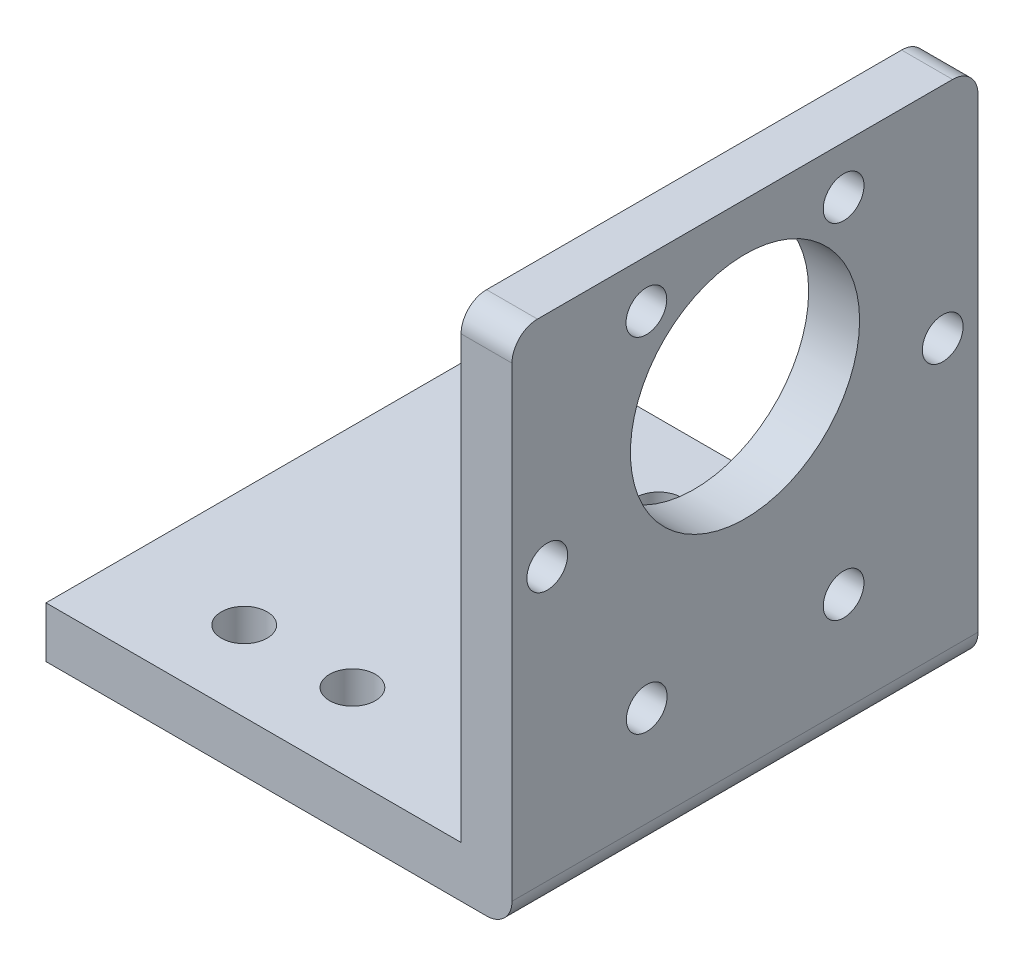
ISO-10303-21;
HEADER;
FILE_DESCRIPTION(('STEP AP214'),'2;1');
FILE_NAME('part.step','',(''),(''),'','','');
FILE_SCHEMA(('AUTOMOTIVE_DESIGN { 1 0 10303 214 1 1 1 1 }'));
ENDSEC;
DATA;
#1=APPLICATION_CONTEXT('core data for automotive mechanical design processes');
#2=APPLICATION_PROTOCOL_DEFINITION('international standard','automotive_design',2000,#1);
#3=PRODUCT_CONTEXT('',#1,'mechanical');
#4=PRODUCT('Part','Part','',(#3));
#5=PRODUCT_RELATED_PRODUCT_CATEGORY('part','',(#4));
#6=PRODUCT_DEFINITION_FORMATION('','',#4);
#7=PRODUCT_DEFINITION_CONTEXT('part definition',#1,'design');
#8=PRODUCT_DEFINITION('design','',#6,#7);
#9=PRODUCT_DEFINITION_SHAPE('','',#8);
#10=(LENGTH_UNIT() NAMED_UNIT(*) SI_UNIT(.MILLI.,.METRE.));
#11=(NAMED_UNIT(*) PLANE_ANGLE_UNIT() SI_UNIT($,.RADIAN.));
#12=(NAMED_UNIT(*) SI_UNIT($,.STERADIAN.) SOLID_ANGLE_UNIT());
#13=UNCERTAINTY_MEASURE_WITH_UNIT(LENGTH_MEASURE(1.E-05),#10,'distance_accuracy_value','');
#14=(GEOMETRIC_REPRESENTATION_CONTEXT(3) GLOBAL_UNCERTAINTY_ASSIGNED_CONTEXT((#13)) GLOBAL_UNIT_ASSIGNED_CONTEXT((#10,
#11,#12)) REPRESENTATION_CONTEXT('',''));
#15=CARTESIAN_POINT('',(0.,0.,0.));
#16=DIRECTION('',(0.,0.,1.));
#17=DIRECTION('',(1.,0.,0.));
#18=AXIS2_PLACEMENT_3D('',#15,#16,#17);
#19=CARTESIAN_POINT('',(18.3,40.6,18.3));
#20=DIRECTION('',(-1.,0.,0.));
#21=DIRECTION('',(0.,0.,1.));
#22=AXIS2_PLACEMENT_3D('',#19,#20,#21);
#23=PLANE('',#22);
#24=CARTESIAN_POINT('',(18.3,9.85104244990387,7.71897426241833));
#25=DIRECTION('',(1.,0.,0.));
#26=DIRECTION('',(0.,0.,-1.));
#27=AXIS2_PLACEMENT_3D('',#24,#25,#26);
#28=CIRCLE('',#27,1.6);
#29=CARTESIAN_POINT('',(18.3,9.85104244990387,6.11897426241833));
#30=VERTEX_POINT('',#29);
#31=EDGE_CURVE('E213',#30,#30,#28,.T.);
#32=ORIENTED_EDGE('',*,*,#31,.F.);
#33=EDGE_LOOP('',(#32));
#34=FACE_BOUND('',#33,.T.);
#35=CARTESIAN_POINT('',(18.3,9.85104244990387,-7.74523523434163));
#36=DIRECTION('',(1.,0.,0.));
#37=DIRECTION('',(0.,0.,-1.));
#38=AXIS2_PLACEMENT_3D('',#35,#36,#37);
#39=CIRCLE('',#38,1.6);
#40=CARTESIAN_POINT('',(18.3,9.85104244990387,-9.34523523434163));
#41=VERTEX_POINT('',#40);
#42=EDGE_CURVE('E217',#41,#41,#39,.T.);
#43=ORIENTED_EDGE('',*,*,#42,.F.);
#44=EDGE_LOOP('',(#43));
#45=FACE_BOUND('',#44,.T.);
#46=CARTESIAN_POINT('',(18.3,23.3800970600801,-15.5299775834848));
#47=DIRECTION('',(1.,0.,0.));
#48=DIRECTION('',(0.,0.,-1.));
#49=AXIS2_PLACEMENT_3D('',#46,#47,#48);
#50=CIRCLE('',#49,1.6);
#51=CARTESIAN_POINT('',(18.3,23.3800970600801,-17.1299775834848));
#52=VERTEX_POINT('',#51);
#53=EDGE_CURVE('E222',#52,#52,#50,.T.);
#54=ORIENTED_EDGE('',*,*,#53,.F.);
#55=EDGE_LOOP('',(#54));
#56=FACE_BOUND('',#55,.T.);
#57=CARTESIAN_POINT('',(18.3,23.3800970600801,15.5299775834848));
#58=DIRECTION('',(1.,0.,0.));
#59=DIRECTION('',(0.,0.,-1.));
#60=AXIS2_PLACEMENT_3D('',#57,#58,#59);
#61=CIRCLE('',#60,1.6);
#62=CARTESIAN_POINT('',(18.3,23.3800970600801,13.9299775834848));
#63=VERTEX_POINT('',#62);
#64=EDGE_CURVE('E351',#63,#63,#61,.T.);
#65=ORIENTED_EDGE('',*,*,#64,.F.);
#66=EDGE_LOOP('',(#65));
#67=FACE_BOUND('',#66,.T.);
#68=CARTESIAN_POINT('',(18.3,36.8636663326293,7.74523523434162));
#69=DIRECTION('',(1.,0.,0.));
#70=DIRECTION('',(0.,0.,-1.));
#71=AXIS2_PLACEMENT_3D('',#68,#69,#70);
#72=CIRCLE('',#71,1.6);
#73=CARTESIAN_POINT('',(18.3,36.8636663326293,6.14523523434162));
#74=VERTEX_POINT('',#73);
#75=EDGE_CURVE('E227',#74,#74,#72,.T.);
#76=ORIENTED_EDGE('',*,*,#75,.F.);
#77=EDGE_LOOP('',(#76));
#78=FACE_BOUND('',#77,.T.);
#79=CARTESIAN_POINT('',(18.3,27.8636663326293,0.));
#80=DIRECTION('',(1.,0.,0.));
#81=DIRECTION('',(0.,0.,-1.));
#82=AXIS2_PLACEMENT_3D('',#79,#80,#81);
#83=CIRCLE('',#82,8.99999999999999);
#84=CARTESIAN_POINT('',(18.3,27.8636663326293,-9.));
#85=VERTEX_POINT('',#84);
#86=EDGE_CURVE('E165',#85,#85,#83,.T.);
#87=ORIENTED_EDGE('',*,*,#86,.F.);
#88=EDGE_LOOP('',(#87));
#89=FACE_BOUND('',#88,.T.);
#90=DIRECTION('',(0.,0.,-1.));
#91=VECTOR('',#90,1.);
#92=CARTESIAN_POINT('',(18.3,40.6,18.3));
#93=LINE('',#92,#91);
#94=CARTESIAN_POINT('',(18.3,40.6,16.3));
#95=VERTEX_POINT('',#94);
#96=CARTESIAN_POINT('',(18.3,40.6,-16.3));
#97=VERTEX_POINT('',#96);
#98=EDGE_CURVE('E235',#95,#97,#93,.T.);
#99=ORIENTED_EDGE('',*,*,#98,.F.);
#100=CARTESIAN_POINT('',(18.3,38.6,16.3));
#101=DIRECTION('',(-1.,0.,0.));
#102=DIRECTION('',(0.,0.,1.));
#103=AXIS2_PLACEMENT_3D('',#100,#101,#102);
#104=CIRCLE('',#103,2.);
#105=CARTESIAN_POINT('',(18.3,38.6,18.3));
#106=VERTEX_POINT('',#105);
#107=EDGE_CURVE('E197',#95,#106,#104,.F.);
#108=ORIENTED_EDGE('',*,*,#107,.T.);
#109=DIRECTION('',(0.,-1.,0.));
#110=VECTOR('',#109,1.);
#111=CARTESIAN_POINT('',(18.3,40.6,18.3));
#112=LINE('',#111,#110);
#113=CARTESIAN_POINT('',(18.3,2.,18.3));
#114=VERTEX_POINT('',#113);
#115=EDGE_CURVE('E152',#106,#114,#112,.T.);
#116=ORIENTED_EDGE('',*,*,#115,.T.);
#117=DIRECTION('',(0.,0.,-1.));
#118=VECTOR('',#117,1.);
#119=CARTESIAN_POINT('',(18.3,2.,18.3));
#120=LINE('',#119,#118);
#121=CARTESIAN_POINT('',(18.3,2.,-18.3));
#122=VERTEX_POINT('',#121);
#123=EDGE_CURVE('E151',#114,#122,#120,.T.);
#124=ORIENTED_EDGE('',*,*,#123,.T.);
#125=DIRECTION('',(0.,-1.,0.));
#126=VECTOR('',#125,1.);
#127=CARTESIAN_POINT('',(18.3,40.6,-18.3));
#128=LINE('',#127,#126);
#129=CARTESIAN_POINT('',(18.3,38.6,-18.3));
#130=VERTEX_POINT('',#129);
#131=EDGE_CURVE('E157',#130,#122,#128,.T.);
#132=ORIENTED_EDGE('',*,*,#131,.F.);
#133=CARTESIAN_POINT('',(18.3,38.6,-16.3));
#134=DIRECTION('',(-1.,0.,0.));
#135=DIRECTION('',(0.,0.,1.));
#136=AXIS2_PLACEMENT_3D('',#133,#134,#135);
#137=CIRCLE('',#136,2.);
#138=EDGE_CURVE('E195',#130,#97,#137,.F.);
#139=ORIENTED_EDGE('',*,*,#138,.T.);
#140=EDGE_LOOP('',(#99,#108,#116,#124,#132,#139));
#141=FACE_BOUND('',#140,.T.);
#142=CARTESIAN_POINT('',(18.3,36.8636663326293,-7.74523523434162));
#143=DIRECTION('',(1.,0.,0.));
#144=DIRECTION('',(0.,0.,-1.));
#145=AXIS2_PLACEMENT_3D('',#142,#143,#144);
#146=CIRCLE('',#145,1.6);
#147=CARTESIAN_POINT('',(18.3,36.8636663326293,-9.34523523434162));
#148=VERTEX_POINT('',#147);
#149=EDGE_CURVE('E354',#148,#148,#146,.F.);
#150=ORIENTED_EDGE('',*,*,#149,.T.);
#151=EDGE_LOOP('',(#150));
#152=FACE_BOUND('',#151,.T.);
#153=ADVANCED_FACE('F53',(#34,#45,#56,#67,#78,#89,#141,#152),#23,.F.);
#154=CARTESIAN_POINT('',(14.3,4.,-18.3));
#155=DIRECTION('',(1.,0.,0.));
#156=DIRECTION('',(0.,0.,-1.));
#157=AXIS2_PLACEMENT_3D('',#154,#155,#156);
#158=PLANE('',#157);
#159=CARTESIAN_POINT('',(14.3,9.85104244990387,7.71897426241833));
#160=DIRECTION('',(1.,0.,0.));
#161=DIRECTION('',(0.,0.,-1.));
#162=AXIS2_PLACEMENT_3D('',#159,#160,#161);
#163=CIRCLE('',#162,1.6);
#164=CARTESIAN_POINT('',(14.3,9.85104244990387,6.11897426241833));
#165=VERTEX_POINT('',#164);
#166=EDGE_CURVE('E180',#165,#165,#163,.T.);
#167=ORIENTED_EDGE('',*,*,#166,.T.);
#168=EDGE_LOOP('',(#167));
#169=FACE_BOUND('',#168,.T.);
#170=CARTESIAN_POINT('',(14.3,9.85104244990387,-7.74523523434163));
#171=DIRECTION('',(1.,0.,0.));
#172=DIRECTION('',(0.,0.,-1.));
#173=AXIS2_PLACEMENT_3D('',#170,#171,#172);
#174=CIRCLE('',#173,1.6);
#175=CARTESIAN_POINT('',(14.3,9.85104244990387,-9.34523523434163));
#176=VERTEX_POINT('',#175);
#177=EDGE_CURVE('E177',#176,#176,#174,.T.);
#178=ORIENTED_EDGE('',*,*,#177,.T.);
#179=EDGE_LOOP('',(#178));
#180=FACE_BOUND('',#179,.T.);
#181=CARTESIAN_POINT('',(14.3,23.3800970600801,-15.5299775834848));
#182=DIRECTION('',(1.,0.,0.));
#183=DIRECTION('',(0.,0.,-1.));
#184=AXIS2_PLACEMENT_3D('',#181,#182,#183);
#185=CIRCLE('',#184,1.6);
#186=CARTESIAN_POINT('',(14.3,23.3800970600801,-17.1299775834848));
#187=VERTEX_POINT('',#186);
#188=EDGE_CURVE('E174',#187,#187,#185,.T.);
#189=ORIENTED_EDGE('',*,*,#188,.T.);
#190=EDGE_LOOP('',(#189));
#191=FACE_BOUND('',#190,.T.);
#192=CARTESIAN_POINT('',(14.3,23.3800970600801,15.5299775834848));
#193=DIRECTION('',(1.,0.,0.));
#194=DIRECTION('',(0.,0.,-1.));
#195=AXIS2_PLACEMENT_3D('',#192,#193,#194);
#196=CIRCLE('',#195,1.6);
#197=CARTESIAN_POINT('',(14.3,23.3800970600801,13.9299775834848));
#198=VERTEX_POINT('',#197);
#199=EDGE_CURVE('E168',#198,#198,#196,.T.);
#200=ORIENTED_EDGE('',*,*,#199,.T.);
#201=EDGE_LOOP('',(#200));
#202=FACE_BOUND('',#201,.T.);
#203=CARTESIAN_POINT('',(14.3,36.8636663326293,7.74523523434162));
#204=DIRECTION('',(1.,0.,0.));
#205=DIRECTION('',(0.,0.,-1.));
#206=AXIS2_PLACEMENT_3D('',#203,#204,#205);
#207=CIRCLE('',#206,1.6);
#208=CARTESIAN_POINT('',(14.3,36.8636663326293,6.14523523434162));
#209=VERTEX_POINT('',#208);
#210=EDGE_CURVE('E164',#209,#209,#207,.T.);
#211=ORIENTED_EDGE('',*,*,#210,.T.);
#212=EDGE_LOOP('',(#211));
#213=FACE_BOUND('',#212,.T.);
#214=CARTESIAN_POINT('',(14.3,27.8636663326293,0.));
#215=DIRECTION('',(1.,0.,0.));
#216=DIRECTION('',(0.,0.,-1.));
#217=AXIS2_PLACEMENT_3D('',#214,#215,#216);
#218=CIRCLE('',#217,8.99999999999999);
#219=CARTESIAN_POINT('',(14.3,27.8636663326293,-9.));
#220=VERTEX_POINT('',#219);
#221=EDGE_CURVE('E161',#220,#220,#218,.T.);
#222=ORIENTED_EDGE('',*,*,#221,.T.);
#223=EDGE_LOOP('',(#222));
#224=FACE_BOUND('',#223,.T.);
#225=DIRECTION('',(0.,1.,0.));
#226=VECTOR('',#225,1.);
#227=CARTESIAN_POINT('',(14.3,4.,18.3));
#228=LINE('',#227,#226);
#229=CARTESIAN_POINT('',(14.3,4.,18.3));
#230=VERTEX_POINT('',#229);
#231=CARTESIAN_POINT('',(14.3,38.6,18.3));
#232=VERTEX_POINT('',#231);
#233=EDGE_CURVE('E144',#230,#232,#228,.T.);
#234=ORIENTED_EDGE('',*,*,#233,.T.);
#235=CARTESIAN_POINT('',(14.3,38.6,16.3));
#236=DIRECTION('',(1.,0.,0.));
#237=DIRECTION('',(0.,0.,-1.));
#238=AXIS2_PLACEMENT_3D('',#235,#236,#237);
#239=CIRCLE('',#238,2.);
#240=CARTESIAN_POINT('',(14.3,40.6,16.3));
#241=VERTEX_POINT('',#240);
#242=EDGE_CURVE('E62',#232,#241,#239,.F.);
#243=ORIENTED_EDGE('',*,*,#242,.T.);
#244=DIRECTION('',(0.,0.,-1.));
#245=VECTOR('',#244,1.);
#246=CARTESIAN_POINT('',(14.3,40.6,-18.3));
#247=LINE('',#246,#245);
#248=CARTESIAN_POINT('',(14.3,40.6,-16.3));
#249=VERTEX_POINT('',#248);
#250=EDGE_CURVE('E138',#241,#249,#247,.T.);
#251=ORIENTED_EDGE('',*,*,#250,.T.);
#252=CARTESIAN_POINT('',(14.3,38.6,-16.3));
#253=DIRECTION('',(1.,0.,0.));
#254=DIRECTION('',(0.,0.,-1.));
#255=AXIS2_PLACEMENT_3D('',#252,#253,#254);
#256=CIRCLE('',#255,2.);
#257=CARTESIAN_POINT('',(14.3,38.6,-18.3));
#258=VERTEX_POINT('',#257);
#259=EDGE_CURVE('E70',#249,#258,#256,.F.);
#260=ORIENTED_EDGE('',*,*,#259,.T.);
#261=DIRECTION('',(0.,1.,0.));
#262=VECTOR('',#261,1.);
#263=CARTESIAN_POINT('',(14.3,4.,-18.3));
#264=LINE('',#263,#262);
#265=CARTESIAN_POINT('',(14.3,4.,-18.3));
#266=VERTEX_POINT('',#265);
#267=EDGE_CURVE('E232',#266,#258,#264,.T.);
#268=ORIENTED_EDGE('',*,*,#267,.F.);
#269=DIRECTION('',(0.,0.,-1.));
#270=VECTOR('',#269,1.);
#271=CARTESIAN_POINT('',(14.3,4.,-18.3));
#272=LINE('',#271,#270);
#273=EDGE_CURVE('E145',#230,#266,#272,.T.);
#274=ORIENTED_EDGE('',*,*,#273,.F.);
#275=EDGE_LOOP('',(#234,#243,#251,#260,#268,#274));
#276=FACE_BOUND('',#275,.T.);
#277=CARTESIAN_POINT('',(14.3,36.8636663326293,-7.74523523434162));
#278=DIRECTION('',(1.,0.,0.));
#279=DIRECTION('',(0.,0.,-1.));
#280=AXIS2_PLACEMENT_3D('',#277,#278,#279);
#281=CIRCLE('',#280,1.6);
#282=CARTESIAN_POINT('',(14.3,36.8636663326293,-9.34523523434162));
#283=VERTEX_POINT('',#282);
#284=EDGE_CURVE('E171',#283,#283,#281,.F.);
#285=ORIENTED_EDGE('',*,*,#284,.F.);
#286=EDGE_LOOP('',(#285));
#287=FACE_BOUND('',#286,.T.);
#288=ADVANCED_FACE('F270',(#169,#180,#191,#202,#213,#224,#276,#287),#158,.F.);
#289=CARTESIAN_POINT('',(-18.3,40.6,18.3));
#290=DIRECTION('',(1.,0.,0.));
#291=DIRECTION('',(0.,0.,-1.));
#292=AXIS2_PLACEMENT_3D('',#289,#290,#291);
#293=PLANE('',#292);
#294=DIRECTION('',(0.,0.,1.));
#295=VECTOR('',#294,1.);
#296=CARTESIAN_POINT('',(-18.3,4.,-18.3));
#297=LINE('',#296,#295);
#298=CARTESIAN_POINT('',(-18.3,4.,-18.3));
#299=VERTEX_POINT('',#298);
#300=CARTESIAN_POINT('',(-18.3,4.,18.3));
#301=VERTEX_POINT('',#300);
#302=EDGE_CURVE('E127',#299,#301,#297,.T.);
#303=ORIENTED_EDGE('',*,*,#302,.F.);
#304=DIRECTION('',(0.,-1.,0.));
#305=VECTOR('',#304,1.);
#306=CARTESIAN_POINT('',(-18.3,40.6,-18.3));
#307=LINE('',#306,#305);
#308=CARTESIAN_POINT('',(-18.3,0.,-18.3));
#309=VERTEX_POINT('',#308);
#310=EDGE_CURVE('E238',#299,#309,#307,.T.);
#311=ORIENTED_EDGE('',*,*,#310,.T.);
#312=DIRECTION('',(0.,0.,1.));
#313=VECTOR('',#312,1.);
#314=CARTESIAN_POINT('',(-18.3,0.,18.3));
#315=LINE('',#314,#313);
#316=CARTESIAN_POINT('',(-18.3,0.,18.3));
#317=VERTEX_POINT('',#316);
#318=EDGE_CURVE('E150',#309,#317,#315,.T.);
#319=ORIENTED_EDGE('',*,*,#318,.T.);
#320=DIRECTION('',(0.,-1.,0.));
#321=VECTOR('',#320,1.);
#322=CARTESIAN_POINT('',(-18.3,40.6,18.3));
#323=LINE('',#322,#321);
#324=EDGE_CURVE('E142',#301,#317,#323,.T.);
#325=ORIENTED_EDGE('',*,*,#324,.F.);
#326=EDGE_LOOP('',(#303,#311,#319,#325));
#327=FACE_BOUND('',#326,.T.);
#328=ADVANCED_FACE('F148',(#327),#293,.F.);
#329=CARTESIAN_POINT('',(18.3,40.6,18.3));
#330=DIRECTION('',(0.,0.,-1.));
#331=DIRECTION('',(-1.,0.,0.));
#332=AXIS2_PLACEMENT_3D('',#329,#330,#331);
#333=PLANE('',#332);
#334=ORIENTED_EDGE('',*,*,#115,.F.);
#335=DIRECTION('',(1.,0.,0.));
#336=VECTOR('',#335,1.);
#337=CARTESIAN_POINT('',(14.3,38.6,18.3));
#338=LINE('',#337,#336);
#339=EDGE_CURVE('E78',#106,#232,#338,.F.);
#340=ORIENTED_EDGE('',*,*,#339,.T.);
#341=ORIENTED_EDGE('',*,*,#233,.F.);
#342=DIRECTION('',(1.,0.,0.));
#343=VECTOR('',#342,1.);
#344=CARTESIAN_POINT('',(-18.3,4.,18.3));
#345=LINE('',#344,#343);
#346=EDGE_CURVE('E131',#301,#230,#345,.T.);
#347=ORIENTED_EDGE('',*,*,#346,.F.);
#348=ORIENTED_EDGE('',*,*,#324,.T.);
#349=DIRECTION('',(1.,0.,0.));
#350=VECTOR('',#349,1.);
#351=CARTESIAN_POINT('',(18.3,0.,18.3));
#352=LINE('',#351,#350);
#353=CARTESIAN_POINT('',(16.3,0.,18.3));
#354=VERTEX_POINT('',#353);
#355=EDGE_CURVE('E241',#317,#354,#352,.T.);
#356=ORIENTED_EDGE('',*,*,#355,.T.);
#357=CARTESIAN_POINT('',(16.3,2.,18.3));
#358=DIRECTION('',(0.,0.,-1.));
#359=DIRECTION('',(-1.,0.,0.));
#360=AXIS2_PLACEMENT_3D('',#357,#358,#359);
#361=CIRCLE('',#360,2.);
#362=EDGE_CURVE('E186',#354,#114,#361,.F.);
#363=ORIENTED_EDGE('',*,*,#362,.T.);
#364=EDGE_LOOP('',(#334,#340,#341,#347,#348,#356,#363));
#365=FACE_BOUND('',#364,.T.);
#366=ADVANCED_FACE('F140',(#365),#333,.F.);
#367=CARTESIAN_POINT('',(18.3,40.6,-18.3));
#368=DIRECTION('',(0.,0.,1.));
#369=DIRECTION('',(1.,0.,0.));
#370=AXIS2_PLACEMENT_3D('',#367,#368,#369);
#371=PLANE('',#370);
#372=ORIENTED_EDGE('',*,*,#267,.T.);
#373=DIRECTION('',(-1.,0.,0.));
#374=VECTOR('',#373,1.);
#375=CARTESIAN_POINT('',(18.3,38.6,-18.3));
#376=LINE('',#375,#374);
#377=EDGE_CURVE('E12',#258,#130,#376,.F.);
#378=ORIENTED_EDGE('',*,*,#377,.T.);
#379=ORIENTED_EDGE('',*,*,#131,.T.);
#380=CARTESIAN_POINT('',(16.3,2.,-18.3));
#381=DIRECTION('',(0.,0.,1.));
#382=DIRECTION('',(1.,0.,0.));
#383=AXIS2_PLACEMENT_3D('',#380,#381,#382);
#384=CIRCLE('',#383,2.);
#385=CARTESIAN_POINT('',(16.3,0.,-18.3));
#386=VERTEX_POINT('',#385);
#387=EDGE_CURVE('E155',#122,#386,#384,.F.);
#388=ORIENTED_EDGE('',*,*,#387,.T.);
#389=DIRECTION('',(-1.,0.,0.));
#390=VECTOR('',#389,1.);
#391=CARTESIAN_POINT('',(18.3,0.,-18.3));
#392=LINE('',#391,#390);
#393=EDGE_CURVE('E239',#386,#309,#392,.T.);
#394=ORIENTED_EDGE('',*,*,#393,.T.);
#395=ORIENTED_EDGE('',*,*,#310,.F.);
#396=DIRECTION('',(-1.,0.,0.));
#397=VECTOR('',#396,1.);
#398=CARTESIAN_POINT('',(-18.3,4.,-18.3));
#399=LINE('',#398,#397);
#400=EDGE_CURVE('E133',#266,#299,#399,.T.);
#401=ORIENTED_EDGE('',*,*,#400,.F.);
#402=EDGE_LOOP('',(#372,#378,#379,#388,#394,#395,#401));
#403=FACE_BOUND('',#402,.T.);
#404=ADVANCED_FACE('F247',(#403),#371,.F.);
#405=CARTESIAN_POINT('',(0.,40.6,0.));
#406=DIRECTION('',(0.,1.,0.));
#407=DIRECTION('',(0.,0.,1.));
#408=AXIS2_PLACEMENT_3D('',#405,#406,#407);
#409=PLANE('',#408);
#410=ORIENTED_EDGE('',*,*,#250,.F.);
#411=DIRECTION('',(1.,0.,0.));
#412=VECTOR('',#411,1.);
#413=CARTESIAN_POINT('',(18.3,40.6,16.3));
#414=LINE('',#413,#412);
#415=EDGE_CURVE('E192',#241,#95,#414,.T.);
#416=ORIENTED_EDGE('',*,*,#415,.T.);
#417=ORIENTED_EDGE('',*,*,#98,.T.);
#418=DIRECTION('',(-1.,0.,0.));
#419=VECTOR('',#418,1.);
#420=CARTESIAN_POINT('',(14.3,40.6,-16.3));
#421=LINE('',#420,#419);
#422=EDGE_CURVE('E189',#97,#249,#421,.T.);
#423=ORIENTED_EDGE('',*,*,#422,.T.);
#424=EDGE_LOOP('',(#410,#416,#417,#423));
#425=FACE_BOUND('',#424,.T.);
#426=ADVANCED_FACE('F265',(#425),#409,.T.);
#427=CARTESIAN_POINT('',(0.,0.,0.));
#428=DIRECTION('',(0.,1.,0.));
#429=DIRECTION('',(0.,0.,1.));
#430=AXIS2_PLACEMENT_3D('',#427,#428,#429);
#431=PLANE('',#430);
#432=CARTESIAN_POINT('',(-0.507384190163681,0.,12.025));
#433=DIRECTION('',(0.,-1.,0.));
#434=DIRECTION('',(0.,0.,1.));
#435=AXIS2_PLACEMENT_3D('',#432,#433,#434);
#436=CIRCLE('',#435,1.8);
#437=CARTESIAN_POINT('',(-0.507384190163681,0.,13.825));
#438=VERTEX_POINT('',#437);
#439=EDGE_CURVE('E375',#438,#438,#436,.T.);
#440=ORIENTED_EDGE('',*,*,#439,.F.);
#441=EDGE_LOOP('',(#440));
#442=FACE_BOUND('',#441,.T.);
#443=CARTESIAN_POINT('',(-9.00738419016373,0.,12.025));
#444=DIRECTION('',(0.,-1.,0.));
#445=DIRECTION('',(0.,0.,1.));
#446=AXIS2_PLACEMENT_3D('',#443,#444,#445);
#447=CIRCLE('',#446,1.8);
#448=CARTESIAN_POINT('',(-9.00738419016373,0.,13.825));
#449=VERTEX_POINT('',#448);
#450=EDGE_CURVE('E378',#449,#449,#447,.T.);
#451=ORIENTED_EDGE('',*,*,#450,.F.);
#452=EDGE_LOOP('',(#451));
#453=FACE_BOUND('',#452,.T.);
#454=CARTESIAN_POINT('',(-9.00738419016373,0.,-12.025));
#455=DIRECTION('',(0.,-1.,0.));
#456=DIRECTION('',(0.,0.,-1.));
#457=AXIS2_PLACEMENT_3D('',#454,#455,#456);
#458=CIRCLE('',#457,1.8);
#459=CARTESIAN_POINT('',(-9.00738419016373,0.,-13.825));
#460=VERTEX_POINT('',#459);
#461=EDGE_CURVE('E374',#460,#460,#458,.T.);
#462=ORIENTED_EDGE('',*,*,#461,.F.);
#463=EDGE_LOOP('',(#462));
#464=FACE_BOUND('',#463,.T.);
#465=CARTESIAN_POINT('',(-0.507384190163732,0.,-12.025));
#466=DIRECTION('',(0.,-1.,0.));
#467=DIRECTION('',(0.,0.,-1.));
#468=AXIS2_PLACEMENT_3D('',#465,#466,#467);
#469=CIRCLE('',#468,1.8);
#470=CARTESIAN_POINT('',(-0.507384190163732,0.,-13.825));
#471=VERTEX_POINT('',#470);
#472=EDGE_CURVE('E206',#471,#471,#469,.T.);
#473=ORIENTED_EDGE('',*,*,#472,.F.);
#474=EDGE_LOOP('',(#473));
#475=FACE_BOUND('',#474,.T.);
#476=ORIENTED_EDGE('',*,*,#393,.F.);
#477=DIRECTION('',(0.,0.,-1.));
#478=VECTOR('',#477,1.);
#479=CARTESIAN_POINT('',(16.3,0.,0.));
#480=LINE('',#479,#478);
#481=EDGE_CURVE('E184',#386,#354,#480,.F.);
#482=ORIENTED_EDGE('',*,*,#481,.T.);
#483=ORIENTED_EDGE('',*,*,#355,.F.);
#484=ORIENTED_EDGE('',*,*,#318,.F.);
#485=EDGE_LOOP('',(#476,#482,#483,#484));
#486=FACE_BOUND('',#485,.T.);
#487=ADVANCED_FACE('F260',(#442,#453,#464,#475,#486),#431,.F.);
#488=CARTESIAN_POINT('',(0.,4.,0.));
#489=DIRECTION('',(0.,1.,0.));
#490=DIRECTION('',(0.,0.,1.));
#491=AXIS2_PLACEMENT_3D('',#488,#489,#490);
#492=PLANE('',#491);
#493=CARTESIAN_POINT('',(-0.507384190163681,4.,12.025));
#494=DIRECTION('',(0.,1.,0.));
#495=DIRECTION('',(0.,0.,1.));
#496=AXIS2_PLACEMENT_3D('',#493,#494,#495);
#497=CIRCLE('',#496,1.8);
#498=CARTESIAN_POINT('',(-0.507384190163681,4.,13.825));
#499=VERTEX_POINT('',#498);
#500=EDGE_CURVE('E57',#499,#499,#497,.T.);
#501=ORIENTED_EDGE('',*,*,#500,.F.);
#502=EDGE_LOOP('',(#501));
#503=FACE_BOUND('',#502,.T.);
#504=CARTESIAN_POINT('',(-9.00738419016373,4.,12.025));
#505=DIRECTION('',(0.,1.,0.));
#506=DIRECTION('',(0.,0.,1.));
#507=AXIS2_PLACEMENT_3D('',#504,#505,#506);
#508=CIRCLE('',#507,1.8);
#509=CARTESIAN_POINT('',(-9.00738419016373,4.,13.825));
#510=VERTEX_POINT('',#509);
#511=EDGE_CURVE('E208',#510,#510,#508,.T.);
#512=ORIENTED_EDGE('',*,*,#511,.F.);
#513=EDGE_LOOP('',(#512));
#514=FACE_BOUND('',#513,.T.);
#515=CARTESIAN_POINT('',(-9.00738419016373,4.,-12.025));
#516=DIRECTION('',(0.,1.,0.));
#517=DIRECTION('',(0.,0.,1.));
#518=AXIS2_PLACEMENT_3D('',#515,#516,#517);
#519=CIRCLE('',#518,1.8);
#520=CARTESIAN_POINT('',(-9.00738419016373,4.,-10.225));
#521=VERTEX_POINT('',#520);
#522=EDGE_CURVE('E205',#521,#521,#519,.T.);
#523=ORIENTED_EDGE('',*,*,#522,.F.);
#524=EDGE_LOOP('',(#523));
#525=FACE_BOUND('',#524,.T.);
#526=CARTESIAN_POINT('',(-0.507384190163732,4.,-12.025));
#527=DIRECTION('',(0.,1.,0.));
#528=DIRECTION('',(0.,0.,1.));
#529=AXIS2_PLACEMENT_3D('',#526,#527,#528);
#530=CIRCLE('',#529,1.8);
#531=CARTESIAN_POINT('',(-0.507384190163732,4.,-10.225));
#532=VERTEX_POINT('',#531);
#533=EDGE_CURVE('E202',#532,#532,#530,.T.);
#534=ORIENTED_EDGE('',*,*,#533,.F.);
#535=EDGE_LOOP('',(#534));
#536=FACE_BOUND('',#535,.T.);
#537=ORIENTED_EDGE('',*,*,#302,.T.);
#538=ORIENTED_EDGE('',*,*,#346,.T.);
#539=ORIENTED_EDGE('',*,*,#273,.T.);
#540=ORIENTED_EDGE('',*,*,#400,.T.);
#541=EDGE_LOOP('',(#537,#538,#539,#540));
#542=FACE_BOUND('',#541,.T.);
#543=ADVANCED_FACE('F129',(#503,#514,#525,#536,#542),#492,.T.);
#544=CARTESIAN_POINT('',(-18.3,27.8636663326293,0.));
#545=DIRECTION('',(1.,0.,0.));
#546=DIRECTION('',(0.,0.,-1.));
#547=AXIS2_PLACEMENT_3D('',#544,#545,#546);
#548=CYLINDRICAL_SURFACE('',#547,8.99999999999999);
#549=ORIENTED_EDGE('',*,*,#86,.T.);
#550=EDGE_LOOP('',(#549));
#551=FACE_BOUND('',#550,.T.);
#552=ORIENTED_EDGE('',*,*,#221,.F.);
#553=EDGE_LOOP('',(#552));
#554=FACE_BOUND('',#553,.T.);
#555=ADVANCED_FACE('F335',(#551,#554),#548,.F.);
#556=CARTESIAN_POINT('',(-18.3,36.8636663326293,7.74523523434162));
#557=DIRECTION('',(1.,0.,0.));
#558=DIRECTION('',(0.,0.,-1.));
#559=AXIS2_PLACEMENT_3D('',#556,#557,#558);
#560=CYLINDRICAL_SURFACE('',#559,1.6);
#561=ORIENTED_EDGE('',*,*,#75,.T.);
#562=EDGE_LOOP('',(#561));
#563=FACE_BOUND('',#562,.T.);
#564=ORIENTED_EDGE('',*,*,#210,.F.);
#565=EDGE_LOOP('',(#564));
#566=FACE_BOUND('',#565,.T.);
#567=ADVANCED_FACE('F290',(#563,#566),#560,.F.);
#568=CARTESIAN_POINT('',(-18.3,23.3800970600801,15.5299775834848));
#569=DIRECTION('',(1.,0.,0.));
#570=DIRECTION('',(0.,0.,-1.));
#571=AXIS2_PLACEMENT_3D('',#568,#569,#570);
#572=CYLINDRICAL_SURFACE('',#571,1.6);
#573=ORIENTED_EDGE('',*,*,#64,.T.);
#574=EDGE_LOOP('',(#573));
#575=FACE_BOUND('',#574,.T.);
#576=ORIENTED_EDGE('',*,*,#199,.F.);
#577=EDGE_LOOP('',(#576));
#578=FACE_BOUND('',#577,.T.);
#579=ADVANCED_FACE('F280',(#575,#578),#572,.F.);
#580=CARTESIAN_POINT('',(-18.3,36.8636663326293,-7.74523523434162));
#581=DIRECTION('',(1.,0.,0.));
#582=DIRECTION('',(0.,0.,-1.));
#583=AXIS2_PLACEMENT_3D('',#580,#581,#582);
#584=CYLINDRICAL_SURFACE('',#583,1.6);
#585=ORIENTED_EDGE('',*,*,#149,.F.);
#586=EDGE_LOOP('',(#585));
#587=FACE_BOUND('',#586,.T.);
#588=ORIENTED_EDGE('',*,*,#284,.T.);
#589=EDGE_LOOP('',(#588));
#590=FACE_BOUND('',#589,.T.);
#591=ADVANCED_FACE('F277',(#587,#590),#584,.F.);
#592=CARTESIAN_POINT('',(-18.3,23.3800970600801,-15.5299775834848));
#593=DIRECTION('',(1.,0.,0.));
#594=DIRECTION('',(0.,0.,-1.));
#595=AXIS2_PLACEMENT_3D('',#592,#593,#594);
#596=CYLINDRICAL_SURFACE('',#595,1.6);
#597=ORIENTED_EDGE('',*,*,#53,.T.);
#598=EDGE_LOOP('',(#597));
#599=FACE_BOUND('',#598,.T.);
#600=ORIENTED_EDGE('',*,*,#188,.F.);
#601=EDGE_LOOP('',(#600));
#602=FACE_BOUND('',#601,.T.);
#603=ADVANCED_FACE('F279',(#599,#602),#596,.F.);
#604=CARTESIAN_POINT('',(-18.3,9.85104244990387,-7.74523523434163));
#605=DIRECTION('',(1.,0.,0.));
#606=DIRECTION('',(0.,0.,-1.));
#607=AXIS2_PLACEMENT_3D('',#604,#605,#606);
#608=CYLINDRICAL_SURFACE('',#607,1.6);
#609=ORIENTED_EDGE('',*,*,#42,.T.);
#610=EDGE_LOOP('',(#609));
#611=FACE_BOUND('',#610,.T.);
#612=ORIENTED_EDGE('',*,*,#177,.F.);
#613=EDGE_LOOP('',(#612));
#614=FACE_BOUND('',#613,.T.);
#615=ADVANCED_FACE('F287',(#611,#614),#608,.F.);
#616=CARTESIAN_POINT('',(-18.3,9.85104244990387,7.71897426241833));
#617=DIRECTION('',(1.,0.,0.));
#618=DIRECTION('',(0.,0.,-1.));
#619=AXIS2_PLACEMENT_3D('',#616,#617,#618);
#620=CYLINDRICAL_SURFACE('',#619,1.6);
#621=ORIENTED_EDGE('',*,*,#31,.T.);
#622=EDGE_LOOP('',(#621));
#623=FACE_BOUND('',#622,.T.);
#624=ORIENTED_EDGE('',*,*,#166,.F.);
#625=EDGE_LOOP('',(#624));
#626=FACE_BOUND('',#625,.T.);
#627=ADVANCED_FACE('F308',(#623,#626),#620,.F.);
#628=CARTESIAN_POINT('',(16.3,2.,18.3));
#629=DIRECTION('',(0.,0.,-1.));
#630=DIRECTION('',(-1.,0.,0.));
#631=AXIS2_PLACEMENT_3D('',#628,#629,#630);
#632=CYLINDRICAL_SURFACE('',#631,2.);
#633=ORIENTED_EDGE('',*,*,#362,.F.);
#634=ORIENTED_EDGE('',*,*,#481,.F.);
#635=ORIENTED_EDGE('',*,*,#387,.F.);
#636=ORIENTED_EDGE('',*,*,#123,.F.);
#637=EDGE_LOOP('',(#633,#634,#635,#636));
#638=FACE_BOUND('',#637,.T.);
#639=ADVANCED_FACE('F256',(#638),#632,.T.);
#640=CARTESIAN_POINT('',(0.,38.6,16.3));
#641=DIRECTION('',(-1.,0.,0.));
#642=DIRECTION('',(0.,0.,1.));
#643=AXIS2_PLACEMENT_3D('',#640,#641,#642);
#644=CYLINDRICAL_SURFACE('',#643,2.);
#645=ORIENTED_EDGE('',*,*,#242,.F.);
#646=ORIENTED_EDGE('',*,*,#339,.F.);
#647=ORIENTED_EDGE('',*,*,#107,.F.);
#648=ORIENTED_EDGE('',*,*,#415,.F.);
#649=EDGE_LOOP('',(#645,#646,#647,#648));
#650=FACE_BOUND('',#649,.T.);
#651=ADVANCED_FACE('F269',(#650),#644,.T.);
#652=CARTESIAN_POINT('',(0.,38.6,-16.3));
#653=DIRECTION('',(1.,0.,0.));
#654=DIRECTION('',(0.,0.,-1.));
#655=AXIS2_PLACEMENT_3D('',#652,#653,#654);
#656=CYLINDRICAL_SURFACE('',#655,2.);
#657=ORIENTED_EDGE('',*,*,#138,.F.);
#658=ORIENTED_EDGE('',*,*,#377,.F.);
#659=ORIENTED_EDGE('',*,*,#259,.F.);
#660=ORIENTED_EDGE('',*,*,#422,.F.);
#661=EDGE_LOOP('',(#657,#658,#659,#660));
#662=FACE_BOUND('',#661,.T.);
#663=ADVANCED_FACE('F55',(#662),#656,.T.);
#664=CARTESIAN_POINT('',(-0.507384190163732,10.,-12.025));
#665=DIRECTION('',(0.,-1.,0.));
#666=DIRECTION('',(0.,0.,-1.));
#667=AXIS2_PLACEMENT_3D('',#664,#665,#666);
#668=CYLINDRICAL_SURFACE('',#667,1.8);
#669=ORIENTED_EDGE('',*,*,#533,.T.);
#670=EDGE_LOOP('',(#669));
#671=FACE_BOUND('',#670,.T.);
#672=ORIENTED_EDGE('',*,*,#472,.T.);
#673=EDGE_LOOP('',(#672));
#674=FACE_BOUND('',#673,.T.);
#675=ADVANCED_FACE('F314',(#671,#674),#668,.F.);
#676=CARTESIAN_POINT('',(-9.00738419016373,10.,-12.025));
#677=DIRECTION('',(0.,-1.,0.));
#678=DIRECTION('',(0.,0.,-1.));
#679=AXIS2_PLACEMENT_3D('',#676,#677,#678);
#680=CYLINDRICAL_SURFACE('',#679,1.8);
#681=ORIENTED_EDGE('',*,*,#522,.T.);
#682=EDGE_LOOP('',(#681));
#683=FACE_BOUND('',#682,.T.);
#684=ORIENTED_EDGE('',*,*,#461,.T.);
#685=EDGE_LOOP('',(#684));
#686=FACE_BOUND('',#685,.T.);
#687=ADVANCED_FACE('F319',(#683,#686),#680,.F.);
#688=CARTESIAN_POINT('',(-9.00738419016373,10.,12.025));
#689=DIRECTION('',(0.,-1.,0.));
#690=DIRECTION('',(0.,0.,-1.));
#691=AXIS2_PLACEMENT_3D('',#688,#689,#690);
#692=CYLINDRICAL_SURFACE('',#691,1.8);
#693=ORIENTED_EDGE('',*,*,#511,.T.);
#694=EDGE_LOOP('',(#693));
#695=FACE_BOUND('',#694,.T.);
#696=ORIENTED_EDGE('',*,*,#450,.T.);
#697=EDGE_LOOP('',(#696));
#698=FACE_BOUND('',#697,.T.);
#699=ADVANCED_FACE('F326',(#695,#698),#692,.F.);
#700=CARTESIAN_POINT('',(-0.507384190163681,10.,12.025));
#701=DIRECTION('',(0.,-1.,0.));
#702=DIRECTION('',(0.,0.,-1.));
#703=AXIS2_PLACEMENT_3D('',#700,#701,#702);
#704=CYLINDRICAL_SURFACE('',#703,1.8);
#705=ORIENTED_EDGE('',*,*,#500,.T.);
#706=EDGE_LOOP('',(#705));
#707=FACE_BOUND('',#706,.T.);
#708=ORIENTED_EDGE('',*,*,#439,.T.);
#709=EDGE_LOOP('',(#708));
#710=FACE_BOUND('',#709,.T.);
#711=ADVANCED_FACE('F332',(#707,#710),#704,.F.);
#712=CLOSED_SHELL('',(#153,#288,#328,#366,#404,#426,#487,#543,#555,#567,#579,#591,#603,#615,
#627,#639,#651,#663,#675,#687,#699,#711));
#713=MANIFOLD_SOLID_BREP('B2',#712);
#714=ADVANCED_BREP_SHAPE_REPRESENTATION('',(#18,#713),#14);
#715=SHAPE_DEFINITION_REPRESENTATION(#9,#714);
ENDSEC;
END-ISO-10303-21;
